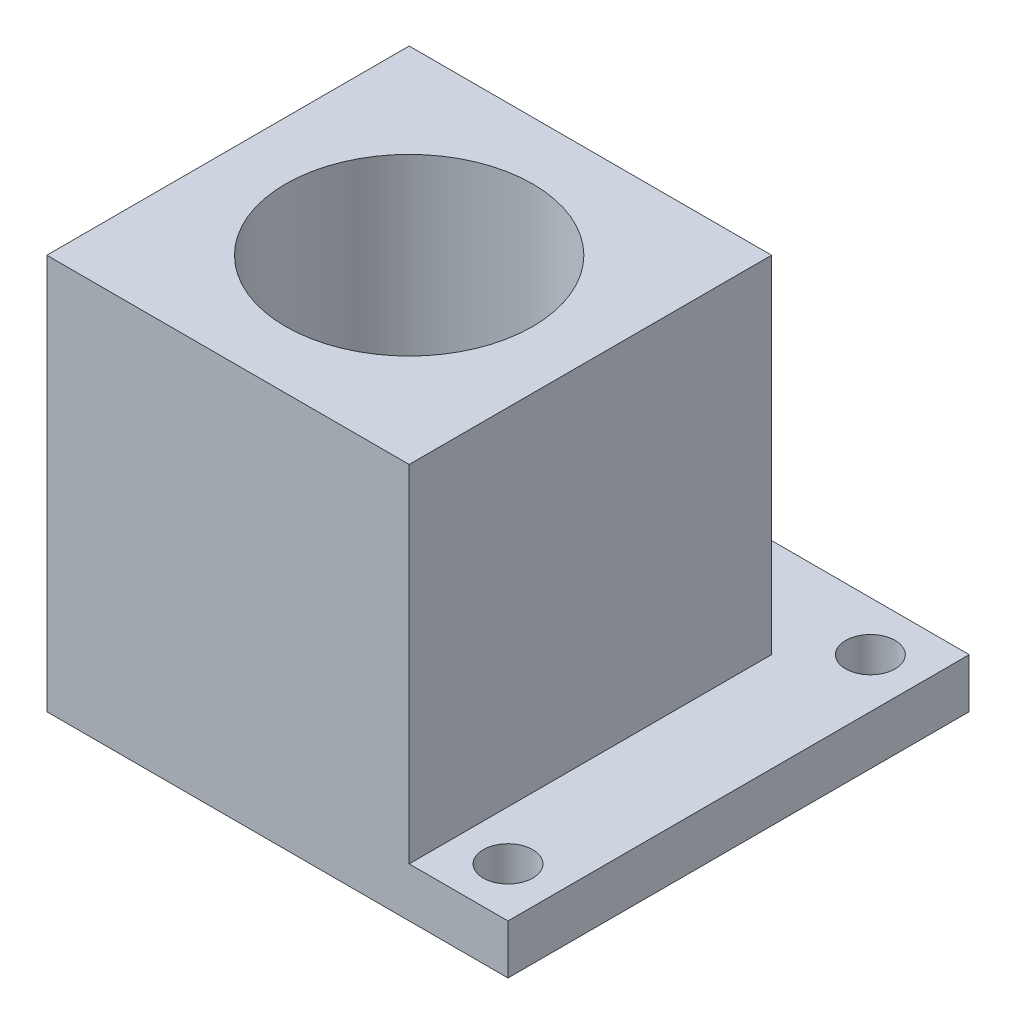
ISO-10303-21;
HEADER;
FILE_DESCRIPTION(('STEP AP214'),'2;1');
FILE_NAME('part.step','',(''),(''),'','','');
FILE_SCHEMA(('AUTOMOTIVE_DESIGN { 1 0 10303 214 1 1 1 1 }'));
ENDSEC;
DATA;
#1=APPLICATION_CONTEXT('core data for automotive mechanical design processes');
#2=APPLICATION_PROTOCOL_DEFINITION('international standard','automotive_design',2000,#1);
#3=PRODUCT_CONTEXT('',#1,'mechanical');
#4=PRODUCT('Part','Part','',(#3));
#5=PRODUCT_RELATED_PRODUCT_CATEGORY('part','',(#4));
#6=PRODUCT_DEFINITION_FORMATION('','',#4);
#7=PRODUCT_DEFINITION_CONTEXT('part definition',#1,'design');
#8=PRODUCT_DEFINITION('design','',#6,#7);
#9=PRODUCT_DEFINITION_SHAPE('','',#8);
#10=(LENGTH_UNIT() NAMED_UNIT(*) SI_UNIT(.MILLI.,.METRE.));
#11=(NAMED_UNIT(*) PLANE_ANGLE_UNIT() SI_UNIT($,.RADIAN.));
#12=(NAMED_UNIT(*) SI_UNIT($,.STERADIAN.) SOLID_ANGLE_UNIT());
#13=UNCERTAINTY_MEASURE_WITH_UNIT(LENGTH_MEASURE(1.E-05),#10,'distance_accuracy_value','');
#14=(GEOMETRIC_REPRESENTATION_CONTEXT(3) GLOBAL_UNCERTAINTY_ASSIGNED_CONTEXT((#13)) GLOBAL_UNIT_ASSIGNED_CONTEXT((#10,
#11,#12)) REPRESENTATION_CONTEXT('',''));
#15=CARTESIAN_POINT('',(0.,0.,0.));
#16=DIRECTION('',(0.,0.,1.));
#17=DIRECTION('',(1.,0.,0.));
#18=AXIS2_PLACEMENT_3D('',#15,#16,#17);
#19=CARTESIAN_POINT('',(22.,24.,0.));
#20=DIRECTION('',(-1.,0.,0.));
#21=DIRECTION('',(0.,0.,1.));
#22=AXIS2_PLACEMENT_3D('',#19,#20,#21);
#23=PLANE('',#22);
#24=DIRECTION('',(0.,0.,1.));
#25=VECTOR('',#24,1.);
#26=CARTESIAN_POINT('',(22.,3.,0.));
#27=LINE('',#26,#25);
#28=CARTESIAN_POINT('',(22.,3.,-22.));
#29=VERTEX_POINT('',#28);
#30=CARTESIAN_POINT('',(22.,3.,0.));
#31=VERTEX_POINT('',#30);
#32=EDGE_CURVE('E54',#29,#31,#27,.T.);
#33=ORIENTED_EDGE('',*,*,#32,.F.);
#34=DIRECTION('',(0.,-1.,0.));
#35=VECTOR('',#34,1.);
#36=CARTESIAN_POINT('',(22.,24.,-22.));
#37=LINE('',#36,#35);
#38=CARTESIAN_POINT('',(22.,24.,-22.));
#39=VERTEX_POINT('',#38);
#40=EDGE_CURVE('E170',#39,#29,#37,.T.);
#41=ORIENTED_EDGE('',*,*,#40,.F.);
#42=DIRECTION('',(0.,0.,-1.));
#43=VECTOR('',#42,1.);
#44=CARTESIAN_POINT('',(22.,24.,0.));
#45=LINE('',#44,#43);
#46=CARTESIAN_POINT('',(22.,24.,0.));
#47=VERTEX_POINT('',#46);
#48=EDGE_CURVE('E163',#47,#39,#45,.T.);
#49=ORIENTED_EDGE('',*,*,#48,.F.);
#50=DIRECTION('',(0.,-1.,0.));
#51=VECTOR('',#50,1.);
#52=CARTESIAN_POINT('',(22.,24.,0.));
#53=LINE('',#52,#51);
#54=EDGE_CURVE('E44',#47,#31,#53,.T.);
#55=ORIENTED_EDGE('',*,*,#54,.T.);
#56=EDGE_LOOP('',(#33,#41,#49,#55));
#57=FACE_BOUND('',#56,.T.);
#58=ADVANCED_FACE('F36',(#57),#23,.F.);
#59=CARTESIAN_POINT('',(0.,24.,-22.));
#60=DIRECTION('',(0.,0.,1.));
#61=DIRECTION('',(1.,0.,0.));
#62=AXIS2_PLACEMENT_3D('',#59,#60,#61);
#63=PLANE('',#62);
#64=DIRECTION('',(1.,0.,0.));
#65=VECTOR('',#64,1.);
#66=CARTESIAN_POINT('',(0.,3.,-22.));
#67=LINE('',#66,#65);
#68=CARTESIAN_POINT('',(0.,3.,-22.));
#69=VERTEX_POINT('',#68);
#70=EDGE_CURVE('E115',#69,#29,#67,.T.);
#71=ORIENTED_EDGE('',*,*,#70,.F.);
#72=DIRECTION('',(0.,-1.,0.));
#73=VECTOR('',#72,1.);
#74=CARTESIAN_POINT('',(0.,24.,-22.));
#75=LINE('',#74,#73);
#76=CARTESIAN_POINT('',(0.,24.,-22.));
#77=VERTEX_POINT('',#76);
#78=EDGE_CURVE('E120',#77,#69,#75,.T.);
#79=ORIENTED_EDGE('',*,*,#78,.F.);
#80=DIRECTION('',(-1.,0.,0.));
#81=VECTOR('',#80,1.);
#82=CARTESIAN_POINT('',(0.,24.,-22.));
#83=LINE('',#82,#81);
#84=EDGE_CURVE('E165',#39,#77,#83,.T.);
#85=ORIENTED_EDGE('',*,*,#84,.F.);
#86=ORIENTED_EDGE('',*,*,#40,.T.);
#87=EDGE_LOOP('',(#71,#79,#85,#86));
#88=FACE_BOUND('',#87,.T.);
#89=ADVANCED_FACE('F173',(#88),#63,.F.);
#90=CARTESIAN_POINT('',(0.,24.,0.));
#91=DIRECTION('',(0.,-1.,0.));
#92=DIRECTION('',(0.,0.,-1.));
#93=AXIS2_PLACEMENT_3D('',#90,#91,#92);
#94=PLANE('',#93);
#95=DIRECTION('',(0.,0.,1.));
#96=VECTOR('',#95,1.);
#97=CARTESIAN_POINT('',(0.,24.,0.));
#98=LINE('',#97,#96);
#99=CARTESIAN_POINT('',(0.,24.,0.));
#100=VERTEX_POINT('',#99);
#101=EDGE_CURVE('E157',#77,#100,#98,.T.);
#102=ORIENTED_EDGE('',*,*,#101,.T.);
#103=DIRECTION('',(1.,0.,0.));
#104=VECTOR('',#103,1.);
#105=CARTESIAN_POINT('',(0.,24.,0.));
#106=LINE('',#105,#104);
#107=EDGE_CURVE('E160',#100,#47,#106,.T.);
#108=ORIENTED_EDGE('',*,*,#107,.T.);
#109=ORIENTED_EDGE('',*,*,#48,.T.);
#110=ORIENTED_EDGE('',*,*,#84,.T.);
#111=EDGE_LOOP('',(#102,#108,#109,#110));
#112=FACE_BOUND('',#111,.T.);
#113=CARTESIAN_POINT('',(11.,24.,-11.));
#114=DIRECTION('',(0.,1.,0.));
#115=DIRECTION('',(0.,0.,1.));
#116=AXIS2_PLACEMENT_3D('',#113,#114,#115);
#117=CIRCLE('',#116,7.5);
#118=CARTESIAN_POINT('',(11.,24.,-3.5));
#119=VERTEX_POINT('',#118);
#120=EDGE_CURVE('E151',#119,#119,#117,.T.);
#121=ORIENTED_EDGE('',*,*,#120,.F.);
#122=EDGE_LOOP('',(#121));
#123=FACE_BOUND('',#122,.T.);
#124=ADVANCED_FACE('F186',(#112,#123),#94,.F.);
#125=CARTESIAN_POINT('',(0.,0.,0.));
#126=DIRECTION('',(0.,-1.,0.));
#127=DIRECTION('',(0.,0.,-1.));
#128=AXIS2_PLACEMENT_3D('',#125,#126,#127);
#129=PLANE('',#128);
#130=DIRECTION('',(0.,0.,1.));
#131=VECTOR('',#130,1.);
#132=CARTESIAN_POINT('',(0.,0.,0.));
#133=LINE('',#132,#131);
#134=CARTESIAN_POINT('',(0.,0.,-28.));
#135=VERTEX_POINT('',#134);
#136=CARTESIAN_POINT('',(0.,0.,0.));
#137=VERTEX_POINT('',#136);
#138=EDGE_CURVE('E154',#135,#137,#133,.T.);
#139=ORIENTED_EDGE('',*,*,#138,.F.);
#140=DIRECTION('',(-1.,0.,0.));
#141=VECTOR('',#140,1.);
#142=CARTESIAN_POINT('',(0.,0.,-28.));
#143=LINE('',#142,#141);
#144=CARTESIAN_POINT('',(28.,0.,-28.));
#145=VERTEX_POINT('',#144);
#146=EDGE_CURVE('E111',#145,#135,#143,.T.);
#147=ORIENTED_EDGE('',*,*,#146,.F.);
#148=DIRECTION('',(0.,0.,-1.));
#149=VECTOR('',#148,1.);
#150=CARTESIAN_POINT('',(28.,0.,0.));
#151=LINE('',#150,#149);
#152=CARTESIAN_POINT('',(28.,0.,0.));
#153=VERTEX_POINT('',#152);
#154=EDGE_CURVE('E143',#153,#145,#151,.T.);
#155=ORIENTED_EDGE('',*,*,#154,.F.);
#156=DIRECTION('',(1.,0.,0.));
#157=VECTOR('',#156,1.);
#158=CARTESIAN_POINT('',(0.,0.,0.));
#159=LINE('',#158,#157);
#160=EDGE_CURVE('E161',#137,#153,#159,.T.);
#161=ORIENTED_EDGE('',*,*,#160,.F.);
#162=EDGE_LOOP('',(#139,#147,#155,#161));
#163=FACE_BOUND('',#162,.T.);
#164=CARTESIAN_POINT('',(11.,0.,-11.));
#165=DIRECTION('',(0.,1.,0.));
#166=DIRECTION('',(0.,0.,1.));
#167=AXIS2_PLACEMENT_3D('',#164,#165,#166);
#168=CIRCLE('',#167,7.5);
#169=CARTESIAN_POINT('',(11.,0.,-3.5));
#170=VERTEX_POINT('',#169);
#171=EDGE_CURVE('E149',#170,#170,#168,.T.);
#172=ORIENTED_EDGE('',*,*,#171,.T.);
#173=EDGE_LOOP('',(#172));
#174=FACE_BOUND('',#173,.T.);
#175=CARTESIAN_POINT('',(3.,0.,-25.));
#176=DIRECTION('',(0.,-1.,0.));
#177=DIRECTION('',(0.,0.,-1.));
#178=AXIS2_PLACEMENT_3D('',#175,#176,#177);
#179=CIRCLE('',#178,1.5);
#180=CARTESIAN_POINT('',(3.,0.,-26.5));
#181=VERTEX_POINT('',#180);
#182=EDGE_CURVE('E133',#181,#181,#179,.T.);
#183=ORIENTED_EDGE('',*,*,#182,.F.);
#184=EDGE_LOOP('',(#183));
#185=FACE_BOUND('',#184,.T.);
#186=CARTESIAN_POINT('',(25.,0.,-3.));
#187=DIRECTION('',(0.,-1.,0.));
#188=DIRECTION('',(0.,0.,-1.));
#189=AXIS2_PLACEMENT_3D('',#186,#187,#188);
#190=CIRCLE('',#189,1.5);
#191=CARTESIAN_POINT('',(25.,0.,-4.5));
#192=VERTEX_POINT('',#191);
#193=EDGE_CURVE('E136',#192,#192,#190,.T.);
#194=ORIENTED_EDGE('',*,*,#193,.F.);
#195=EDGE_LOOP('',(#194));
#196=FACE_BOUND('',#195,.T.);
#197=CARTESIAN_POINT('',(25.,0.,-25.));
#198=DIRECTION('',(0.,-1.,0.));
#199=DIRECTION('',(0.,0.,-1.));
#200=AXIS2_PLACEMENT_3D('',#197,#198,#199);
#201=CIRCLE('',#200,1.5);
#202=CARTESIAN_POINT('',(25.,0.,-26.5));
#203=VERTEX_POINT('',#202);
#204=EDGE_CURVE('E139',#203,#203,#201,.T.);
#205=ORIENTED_EDGE('',*,*,#204,.F.);
#206=EDGE_LOOP('',(#205));
#207=FACE_BOUND('',#206,.T.);
#208=ADVANCED_FACE('F182',(#163,#174,#185,#196,#207),#129,.T.);
#209=CARTESIAN_POINT('',(0.,24.,0.));
#210=DIRECTION('',(1.,0.,0.));
#211=DIRECTION('',(0.,0.,-1.));
#212=AXIS2_PLACEMENT_3D('',#209,#210,#211);
#213=PLANE('',#212);
#214=ORIENTED_EDGE('',*,*,#138,.T.);
#215=DIRECTION('',(0.,-1.,0.));
#216=VECTOR('',#215,1.);
#217=CARTESIAN_POINT('',(0.,24.,0.));
#218=LINE('',#217,#216);
#219=EDGE_CURVE('E11',#100,#137,#218,.T.);
#220=ORIENTED_EDGE('',*,*,#219,.F.);
#221=ORIENTED_EDGE('',*,*,#101,.F.);
#222=ORIENTED_EDGE('',*,*,#78,.T.);
#223=DIRECTION('',(0.,0.,1.));
#224=VECTOR('',#223,1.);
#225=CARTESIAN_POINT('',(0.,3.,0.));
#226=LINE('',#225,#224);
#227=CARTESIAN_POINT('',(0.,3.,-28.));
#228=VERTEX_POINT('',#227);
#229=EDGE_CURVE('E99',#228,#69,#226,.T.);
#230=ORIENTED_EDGE('',*,*,#229,.F.);
#231=DIRECTION('',(0.,-1.,0.));
#232=VECTOR('',#231,1.);
#233=CARTESIAN_POINT('',(0.,3.,-28.));
#234=LINE('',#233,#232);
#235=EDGE_CURVE('E108',#228,#135,#234,.T.);
#236=ORIENTED_EDGE('',*,*,#235,.T.);
#237=EDGE_LOOP('',(#214,#220,#221,#222,#230,#236));
#238=FACE_BOUND('',#237,.T.);
#239=ADVANCED_FACE('F38',(#238),#213,.F.);
#240=CARTESIAN_POINT('',(0.,24.,0.));
#241=DIRECTION('',(0.,0.,-1.));
#242=DIRECTION('',(-1.,0.,0.));
#243=AXIS2_PLACEMENT_3D('',#240,#241,#242);
#244=PLANE('',#243);
#245=ORIENTED_EDGE('',*,*,#160,.T.);
#246=DIRECTION('',(0.,-1.,0.));
#247=VECTOR('',#246,1.);
#248=CARTESIAN_POINT('',(28.,3.,0.));
#249=LINE('',#248,#247);
#250=CARTESIAN_POINT('',(28.,3.,0.));
#251=VERTEX_POINT('',#250);
#252=EDGE_CURVE('E146',#251,#153,#249,.T.);
#253=ORIENTED_EDGE('',*,*,#252,.F.);
#254=DIRECTION('',(1.,0.,0.));
#255=VECTOR('',#254,1.);
#256=CARTESIAN_POINT('',(0.,3.,0.));
#257=LINE('',#256,#255);
#258=EDGE_CURVE('E129',#31,#251,#257,.T.);
#259=ORIENTED_EDGE('',*,*,#258,.F.);
#260=ORIENTED_EDGE('',*,*,#54,.F.);
#261=ORIENTED_EDGE('',*,*,#107,.F.);
#262=ORIENTED_EDGE('',*,*,#219,.T.);
#263=EDGE_LOOP('',(#245,#253,#259,#260,#261,#262));
#264=FACE_BOUND('',#263,.T.);
#265=ADVANCED_FACE('F177',(#264),#244,.F.);
#266=CARTESIAN_POINT('',(11.,24.,-11.));
#267=DIRECTION('',(0.,-1.,0.));
#268=DIRECTION('',(0.,0.,-1.));
#269=AXIS2_PLACEMENT_3D('',#266,#267,#268);
#270=CYLINDRICAL_SURFACE('',#269,7.5);
#271=ORIENTED_EDGE('',*,*,#120,.T.);
#272=EDGE_LOOP('',(#271));
#273=FACE_BOUND('',#272,.T.);
#274=ORIENTED_EDGE('',*,*,#171,.F.);
#275=EDGE_LOOP('',(#274));
#276=FACE_BOUND('',#275,.T.);
#277=ADVANCED_FACE('F196',(#273,#276),#270,.F.);
#278=CARTESIAN_POINT('',(28.,3.,0.));
#279=DIRECTION('',(-1.,0.,0.));
#280=DIRECTION('',(0.,0.,1.));
#281=AXIS2_PLACEMENT_3D('',#278,#279,#280);
#282=PLANE('',#281);
#283=ORIENTED_EDGE('',*,*,#154,.T.);
#284=DIRECTION('',(0.,-1.,0.));
#285=VECTOR('',#284,1.);
#286=CARTESIAN_POINT('',(28.,3.,-28.));
#287=LINE('',#286,#285);
#288=CARTESIAN_POINT('',(28.,3.,-28.));
#289=VERTEX_POINT('',#288);
#290=EDGE_CURVE('E114',#289,#145,#287,.T.);
#291=ORIENTED_EDGE('',*,*,#290,.F.);
#292=DIRECTION('',(0.,0.,-1.));
#293=VECTOR('',#292,1.);
#294=CARTESIAN_POINT('',(28.,3.,0.));
#295=LINE('',#294,#293);
#296=EDGE_CURVE('E101',#251,#289,#295,.T.);
#297=ORIENTED_EDGE('',*,*,#296,.F.);
#298=ORIENTED_EDGE('',*,*,#252,.T.);
#299=EDGE_LOOP('',(#283,#291,#297,#298));
#300=FACE_BOUND('',#299,.T.);
#301=ADVANCED_FACE('F180',(#300),#282,.F.);
#302=CARTESIAN_POINT('',(25.,3.,-25.));
#303=DIRECTION('',(0.,-1.,0.));
#304=DIRECTION('',(0.,0.,-1.));
#305=AXIS2_PLACEMENT_3D('',#302,#303,#304);
#306=CYLINDRICAL_SURFACE('',#305,1.5);
#307=CARTESIAN_POINT('',(25.,3.,-25.));
#308=DIRECTION('',(0.,-1.,0.));
#309=DIRECTION('',(0.,0.,-1.));
#310=AXIS2_PLACEMENT_3D('',#307,#308,#309);
#311=CIRCLE('',#310,1.5);
#312=CARTESIAN_POINT('',(25.,3.,-26.5));
#313=VERTEX_POINT('',#312);
#314=EDGE_CURVE('E121',#313,#313,#311,.T.);
#315=ORIENTED_EDGE('',*,*,#314,.F.);
#316=EDGE_LOOP('',(#315));
#317=FACE_BOUND('',#316,.T.);
#318=ORIENTED_EDGE('',*,*,#204,.T.);
#319=EDGE_LOOP('',(#318));
#320=FACE_BOUND('',#319,.T.);
#321=ADVANCED_FACE('F218',(#317,#320),#306,.F.);
#322=CARTESIAN_POINT('',(25.,3.,-3.));
#323=DIRECTION('',(0.,-1.,0.));
#324=DIRECTION('',(0.,0.,-1.));
#325=AXIS2_PLACEMENT_3D('',#322,#323,#324);
#326=CYLINDRICAL_SURFACE('',#325,1.5);
#327=CARTESIAN_POINT('',(25.,3.,-3.));
#328=DIRECTION('',(0.,-1.,0.));
#329=DIRECTION('',(0.,0.,-1.));
#330=AXIS2_PLACEMENT_3D('',#327,#328,#329);
#331=CIRCLE('',#330,1.5);
#332=CARTESIAN_POINT('',(25.,3.,-4.5));
#333=VERTEX_POINT('',#332);
#334=EDGE_CURVE('E124',#333,#333,#331,.T.);
#335=ORIENTED_EDGE('',*,*,#334,.F.);
#336=EDGE_LOOP('',(#335));
#337=FACE_BOUND('',#336,.T.);
#338=ORIENTED_EDGE('',*,*,#193,.T.);
#339=EDGE_LOOP('',(#338));
#340=FACE_BOUND('',#339,.T.);
#341=ADVANCED_FACE('F214',(#337,#340),#326,.F.);
#342=CARTESIAN_POINT('',(3.,3.,-25.));
#343=DIRECTION('',(0.,-1.,0.));
#344=DIRECTION('',(0.,0.,-1.));
#345=AXIS2_PLACEMENT_3D('',#342,#343,#344);
#346=CYLINDRICAL_SURFACE('',#345,1.5);
#347=CARTESIAN_POINT('',(3.,3.,-25.));
#348=DIRECTION('',(0.,-1.,0.));
#349=DIRECTION('',(0.,0.,-1.));
#350=AXIS2_PLACEMENT_3D('',#347,#348,#349);
#351=CIRCLE('',#350,1.5);
#352=CARTESIAN_POINT('',(3.,3.,-26.5));
#353=VERTEX_POINT('',#352);
#354=EDGE_CURVE('E145',#353,#353,#351,.T.);
#355=ORIENTED_EDGE('',*,*,#354,.F.);
#356=EDGE_LOOP('',(#355));
#357=FACE_BOUND('',#356,.T.);
#358=ORIENTED_EDGE('',*,*,#182,.T.);
#359=EDGE_LOOP('',(#358));
#360=FACE_BOUND('',#359,.T.);
#361=ADVANCED_FACE('F211',(#357,#360),#346,.F.);
#362=CARTESIAN_POINT('',(0.,3.,-28.));
#363=DIRECTION('',(0.,0.,1.));
#364=DIRECTION('',(1.,0.,0.));
#365=AXIS2_PLACEMENT_3D('',#362,#363,#364);
#366=PLANE('',#365);
#367=ORIENTED_EDGE('',*,*,#146,.T.);
#368=ORIENTED_EDGE('',*,*,#235,.F.);
#369=DIRECTION('',(-1.,0.,0.));
#370=VECTOR('',#369,1.);
#371=CARTESIAN_POINT('',(0.,3.,-28.));
#372=LINE('',#371,#370);
#373=EDGE_CURVE('E94',#289,#228,#372,.T.);
#374=ORIENTED_EDGE('',*,*,#373,.F.);
#375=ORIENTED_EDGE('',*,*,#290,.T.);
#376=EDGE_LOOP('',(#367,#368,#374,#375));
#377=FACE_BOUND('',#376,.T.);
#378=ADVANCED_FACE('F109',(#377),#366,.F.);
#379=CARTESIAN_POINT('',(0.,3.,0.));
#380=DIRECTION('',(0.,-1.,0.));
#381=DIRECTION('',(0.,0.,-1.));
#382=AXIS2_PLACEMENT_3D('',#379,#380,#381);
#383=PLANE('',#382);
#384=ORIENTED_EDGE('',*,*,#354,.T.);
#385=EDGE_LOOP('',(#384));
#386=FACE_BOUND('',#385,.T.);
#387=ORIENTED_EDGE('',*,*,#334,.T.);
#388=EDGE_LOOP('',(#387));
#389=FACE_BOUND('',#388,.T.);
#390=ORIENTED_EDGE('',*,*,#314,.T.);
#391=EDGE_LOOP('',(#390));
#392=FACE_BOUND('',#391,.T.);
#393=ORIENTED_EDGE('',*,*,#229,.T.);
#394=ORIENTED_EDGE('',*,*,#70,.T.);
#395=ORIENTED_EDGE('',*,*,#32,.T.);
#396=ORIENTED_EDGE('',*,*,#258,.T.);
#397=ORIENTED_EDGE('',*,*,#296,.T.);
#398=ORIENTED_EDGE('',*,*,#373,.T.);
#399=EDGE_LOOP('',(#393,#394,#395,#396,#397,#398));
#400=FACE_BOUND('',#399,.T.);
#401=ADVANCED_FACE('F96',(#386,#389,#392,#400),#383,.F.);
#402=CLOSED_SHELL('',(#58,#89,#124,#208,#239,#265,#277,#301,#321,#341,#361,#378,#401));
#403=MANIFOLD_SOLID_BREP('B2',#402);
#404=ADVANCED_BREP_SHAPE_REPRESENTATION('',(#18,#403),#14);
#405=SHAPE_DEFINITION_REPRESENTATION(#9,#404);
ENDSEC;
END-ISO-10303-21;
